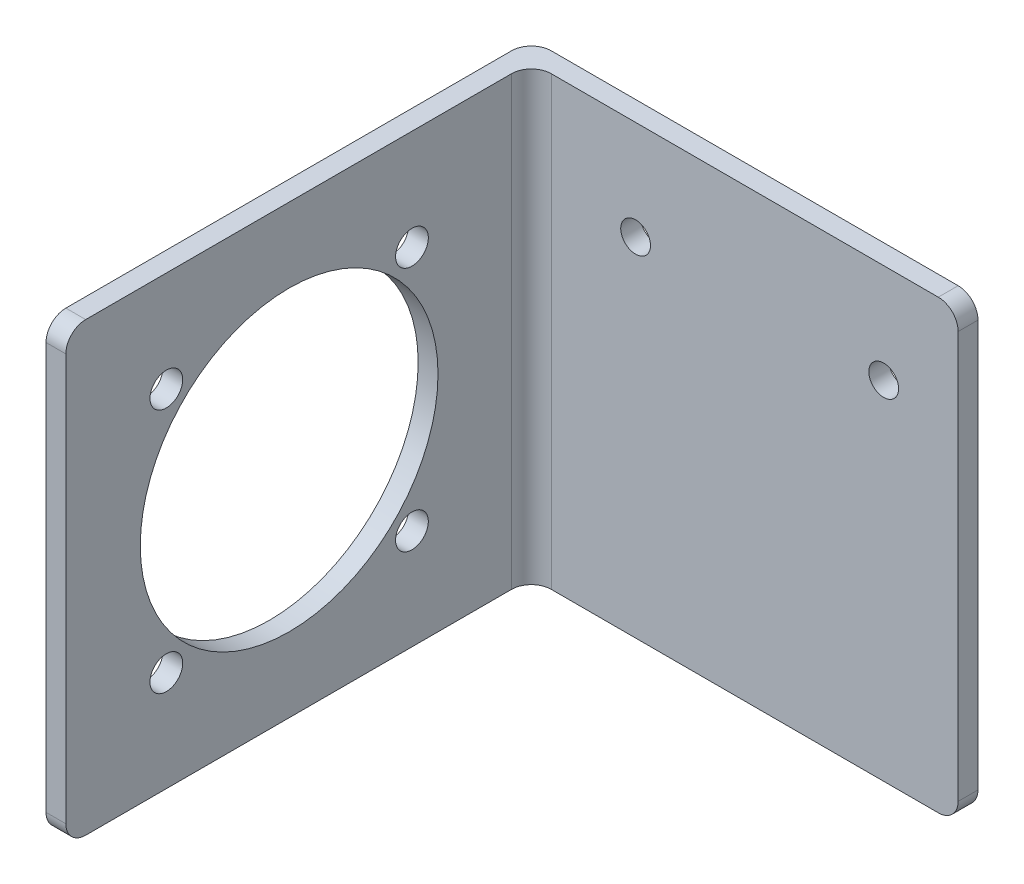
ISO-10303-21;
HEADER;
FILE_DESCRIPTION(('STEP AP214'),'2;1');
FILE_NAME('part.step','',(''),(''),'','','');
FILE_SCHEMA(('AUTOMOTIVE_DESIGN { 1 0 10303 214 1 1 1 1 }'));
ENDSEC;
DATA;
#1=APPLICATION_CONTEXT('core data for automotive mechanical design processes');
#2=APPLICATION_PROTOCOL_DEFINITION('international standard','automotive_design',2000,#1);
#3=PRODUCT_CONTEXT('',#1,'mechanical');
#4=PRODUCT('Part','Part','',(#3));
#5=PRODUCT_RELATED_PRODUCT_CATEGORY('part','',(#4));
#6=PRODUCT_DEFINITION_FORMATION('','',#4);
#7=PRODUCT_DEFINITION_CONTEXT('part definition',#1,'design');
#8=PRODUCT_DEFINITION('design','',#6,#7);
#9=PRODUCT_DEFINITION_SHAPE('','',#8);
#10=(LENGTH_UNIT() NAMED_UNIT(*) SI_UNIT(.MILLI.,.METRE.));
#11=(NAMED_UNIT(*) PLANE_ANGLE_UNIT() SI_UNIT($,.RADIAN.));
#12=(NAMED_UNIT(*) SI_UNIT($,.STERADIAN.) SOLID_ANGLE_UNIT());
#13=UNCERTAINTY_MEASURE_WITH_UNIT(LENGTH_MEASURE(1.E-05),#10,'distance_accuracy_value','');
#14=(GEOMETRIC_REPRESENTATION_CONTEXT(3) GLOBAL_UNCERTAINTY_ASSIGNED_CONTEXT((#13)) GLOBAL_UNIT_ASSIGNED_CONTEXT((#10,
#11,#12)) REPRESENTATION_CONTEXT('',''));
#15=CARTESIAN_POINT('',(0.,0.,0.));
#16=DIRECTION('',(0.,0.,1.));
#17=DIRECTION('',(1.,0.,0.));
#18=AXIS2_PLACEMENT_3D('',#15,#16,#17);
#19=CARTESIAN_POINT('',(0.,45.,-46.91));
#20=DIRECTION('',(0.,0.,-1.));
#21=DIRECTION('',(-1.,0.,0.));
#22=AXIS2_PLACEMENT_3D('',#19,#20,#21);
#23=PLANE('',#22);
#24=CARTESIAN_POINT('',(12.5,35.,-46.91));
#25=DIRECTION('',(0.,0.,1.));
#26=DIRECTION('',(1.,0.,0.));
#27=AXIS2_PLACEMENT_3D('',#24,#25,#26);
#28=CIRCLE('',#27,1.5);
#29=CARTESIAN_POINT('',(14.,35.,-46.91));
#30=VERTEX_POINT('',#29);
#31=EDGE_CURVE('E238',#30,#30,#28,.T.);
#32=ORIENTED_EDGE('',*,*,#31,.F.);
#33=EDGE_LOOP('',(#32));
#34=FACE_BOUND('',#33,.T.);
#35=CARTESIAN_POINT('',(37.5,35.,-46.91));
#36=DIRECTION('',(0.,0.,1.));
#37=DIRECTION('',(1.,0.,0.));
#38=AXIS2_PLACEMENT_3D('',#35,#36,#37);
#39=CIRCLE('',#38,1.5);
#40=CARTESIAN_POINT('',(39.,35.,-46.91));
#41=VERTEX_POINT('',#40);
#42=EDGE_CURVE('E244',#41,#41,#39,.T.);
#43=ORIENTED_EDGE('',*,*,#42,.F.);
#44=EDGE_LOOP('',(#43));
#45=FACE_BOUND('',#44,.T.);
#46=DIRECTION('',(1.,0.,0.));
#47=VECTOR('',#46,1.);
#48=CARTESIAN_POINT('',(0.,0.,-46.91));
#49=LINE('',#48,#47);
#50=CARTESIAN_POINT('',(4.,0.,-46.91));
#51=VERTEX_POINT('',#50);
#52=CARTESIAN_POINT('',(43.,0.,-46.91));
#53=VERTEX_POINT('',#52);
#54=EDGE_CURVE('E149',#51,#53,#49,.T.);
#55=ORIENTED_EDGE('',*,*,#54,.T.);
#56=CARTESIAN_POINT('',(43.,2.,-46.91));
#57=DIRECTION('',(0.,0.,-1.));
#58=DIRECTION('',(-1.,0.,0.));
#59=AXIS2_PLACEMENT_3D('',#56,#57,#58);
#60=CIRCLE('',#59,2.);
#61=CARTESIAN_POINT('',(45.,2.00000000000002,-46.91));
#62=VERTEX_POINT('',#61);
#63=EDGE_CURVE('E200',#53,#62,#60,.F.);
#64=ORIENTED_EDGE('',*,*,#63,.T.);
#65=DIRECTION('',(0.,-1.,0.));
#66=VECTOR('',#65,1.);
#67=CARTESIAN_POINT('',(45.,45.,-46.91));
#68=LINE('',#67,#66);
#69=CARTESIAN_POINT('',(45.,43.,-46.91));
#70=VERTEX_POINT('',#69);
#71=EDGE_CURVE('E152',#70,#62,#68,.T.);
#72=ORIENTED_EDGE('',*,*,#71,.F.);
#73=CARTESIAN_POINT('',(43.,43.,-46.91));
#74=DIRECTION('',(0.,0.,-1.));
#75=DIRECTION('',(-1.,0.,0.));
#76=AXIS2_PLACEMENT_3D('',#73,#74,#75);
#77=CIRCLE('',#76,2.);
#78=CARTESIAN_POINT('',(43.,45.,-46.91));
#79=VERTEX_POINT('',#78);
#80=EDGE_CURVE('E198',#70,#79,#77,.F.);
#81=ORIENTED_EDGE('',*,*,#80,.T.);
#82=DIRECTION('',(1.,0.,0.));
#83=VECTOR('',#82,1.);
#84=CARTESIAN_POINT('',(0.,45.,-46.91));
#85=LINE('',#84,#83);
#86=CARTESIAN_POINT('',(4.,45.,-46.91));
#87=VERTEX_POINT('',#86);
#88=EDGE_CURVE('E151',#87,#79,#85,.T.);
#89=ORIENTED_EDGE('',*,*,#88,.F.);
#90=DIRECTION('',(0.,-1.,0.));
#91=VECTOR('',#90,1.);
#92=CARTESIAN_POINT('',(4.,0.,-46.91));
#93=LINE('',#92,#91);
#94=EDGE_CURVE('E137',#87,#51,#93,.T.);
#95=ORIENTED_EDGE('',*,*,#94,.T.);
#96=EDGE_LOOP('',(#55,#64,#72,#81,#89,#95));
#97=FACE_BOUND('',#96,.T.);
#98=ADVANCED_FACE('F41',(#34,#45,#97),#23,.F.);
#99=CARTESIAN_POINT('',(45.,45.,-48.91));
#100=DIRECTION('',(1.,0.,0.));
#101=DIRECTION('',(0.,0.,-1.));
#102=AXIS2_PLACEMENT_3D('',#99,#100,#101);
#103=PLANE('',#102);
#104=ORIENTED_EDGE('',*,*,#71,.T.);
#105=DIRECTION('',(0.,0.,1.));
#106=VECTOR('',#105,1.);
#107=CARTESIAN_POINT('',(45.,2.,-48.91));
#108=LINE('',#107,#106);
#109=CARTESIAN_POINT('',(45.,2.00000000000002,-48.91));
#110=VERTEX_POINT('',#109);
#111=EDGE_CURVE('E205',#62,#110,#108,.F.);
#112=ORIENTED_EDGE('',*,*,#111,.T.);
#113=DIRECTION('',(0.,-1.,0.));
#114=VECTOR('',#113,1.);
#115=CARTESIAN_POINT('',(45.,45.,-48.91));
#116=LINE('',#115,#114);
#117=CARTESIAN_POINT('',(45.,43.,-48.91));
#118=VERTEX_POINT('',#117);
#119=EDGE_CURVE('E178',#118,#110,#116,.T.);
#120=ORIENTED_EDGE('',*,*,#119,.F.);
#121=DIRECTION('',(0.,0.,1.));
#122=VECTOR('',#121,1.);
#123=CARTESIAN_POINT('',(45.,43.,-46.91));
#124=LINE('',#123,#122);
#125=EDGE_CURVE('E202',#118,#70,#124,.T.);
#126=ORIENTED_EDGE('',*,*,#125,.T.);
#127=EDGE_LOOP('',(#104,#112,#120,#126));
#128=FACE_BOUND('',#127,.T.);
#129=ADVANCED_FACE('F300',(#128),#103,.T.);
#130=CARTESIAN_POINT('',(0.,45.,-48.91));
#131=DIRECTION('',(0.,0.,-1.));
#132=DIRECTION('',(-1.,0.,0.));
#133=AXIS2_PLACEMENT_3D('',#130,#131,#132);
#134=PLANE('',#133);
#135=CARTESIAN_POINT('',(12.5,35.,-48.91));
#136=DIRECTION('',(0.,0.,-1.));
#137=DIRECTION('',(-1.,0.,0.));
#138=AXIS2_PLACEMENT_3D('',#135,#136,#137);
#139=CIRCLE('',#138,1.5);
#140=CARTESIAN_POINT('',(11.,35.,-48.91));
#141=VERTEX_POINT('',#140);
#142=EDGE_CURVE('E45',#141,#141,#139,.T.);
#143=ORIENTED_EDGE('',*,*,#142,.F.);
#144=EDGE_LOOP('',(#143));
#145=FACE_BOUND('',#144,.T.);
#146=CARTESIAN_POINT('',(37.5,35.,-48.91));
#147=DIRECTION('',(0.,0.,-1.));
#148=DIRECTION('',(-1.,0.,0.));
#149=AXIS2_PLACEMENT_3D('',#146,#147,#148);
#150=CIRCLE('',#149,1.5);
#151=CARTESIAN_POINT('',(36.,35.,-48.91));
#152=VERTEX_POINT('',#151);
#153=EDGE_CURVE('E236',#152,#152,#150,.T.);
#154=ORIENTED_EDGE('',*,*,#153,.F.);
#155=EDGE_LOOP('',(#154));
#156=FACE_BOUND('',#155,.T.);
#157=ORIENTED_EDGE('',*,*,#119,.T.);
#158=CARTESIAN_POINT('',(43.,2.,-48.91));
#159=DIRECTION('',(0.,0.,-1.));
#160=DIRECTION('',(-1.,0.,0.));
#161=AXIS2_PLACEMENT_3D('',#158,#159,#160);
#162=CIRCLE('',#161,2.);
#163=CARTESIAN_POINT('',(43.,0.,-48.91));
#164=VERTEX_POINT('',#163);
#165=EDGE_CURVE('E209',#110,#164,#162,.T.);
#166=ORIENTED_EDGE('',*,*,#165,.T.);
#167=DIRECTION('',(1.,0.,0.));
#168=VECTOR('',#167,1.);
#169=CARTESIAN_POINT('',(0.,0.,-48.91));
#170=LINE('',#169,#168);
#171=CARTESIAN_POINT('',(2.,0.,-48.91));
#172=VERTEX_POINT('',#171);
#173=EDGE_CURVE('E159',#172,#164,#170,.T.);
#174=ORIENTED_EDGE('',*,*,#173,.F.);
#175=DIRECTION('',(0.,-1.,0.));
#176=VECTOR('',#175,1.);
#177=CARTESIAN_POINT('',(2.,45.,-48.91));
#178=LINE('',#177,#176);
#179=CARTESIAN_POINT('',(2.,45.,-48.91));
#180=VERTEX_POINT('',#179);
#181=EDGE_CURVE('E189',#172,#180,#178,.F.);
#182=ORIENTED_EDGE('',*,*,#181,.T.);
#183=DIRECTION('',(1.,0.,0.));
#184=VECTOR('',#183,1.);
#185=CARTESIAN_POINT('',(0.,45.,-48.91));
#186=LINE('',#185,#184);
#187=CARTESIAN_POINT('',(43.,45.,-48.91));
#188=VERTEX_POINT('',#187);
#189=EDGE_CURVE('E264',#180,#188,#186,.T.);
#190=ORIENTED_EDGE('',*,*,#189,.T.);
#191=CARTESIAN_POINT('',(43.,43.,-48.91));
#192=DIRECTION('',(0.,0.,-1.));
#193=DIRECTION('',(-1.,0.,0.));
#194=AXIS2_PLACEMENT_3D('',#191,#192,#193);
#195=CIRCLE('',#194,2.);
#196=EDGE_CURVE('E207',#188,#118,#195,.T.);
#197=ORIENTED_EDGE('',*,*,#196,.T.);
#198=EDGE_LOOP('',(#157,#166,#174,#182,#190,#197));
#199=FACE_BOUND('',#198,.T.);
#200=ADVANCED_FACE('F292',(#145,#156,#199),#134,.T.);
#201=CARTESIAN_POINT('',(0.,45.,0.));
#202=DIRECTION('',(-1.,0.,0.));
#203=DIRECTION('',(0.,0.,1.));
#204=AXIS2_PLACEMENT_3D('',#201,#202,#203);
#205=PLANE('',#204);
#206=CARTESIAN_POINT('',(0.,34.8743686707187,-34.8743686708039));
#207=DIRECTION('',(-1.,0.,0.));
#208=DIRECTION('',(0.,0.,1.));
#209=AXIS2_PLACEMENT_3D('',#206,#207,#208);
#210=CIRCLE('',#209,1.65000000004969);
#211=CARTESIAN_POINT('',(0.,34.8743686707187,-33.2243686707542));
#212=VERTEX_POINT('',#211);
#213=EDGE_CURVE('E242',#212,#212,#210,.T.);
#214=ORIENTED_EDGE('',*,*,#213,.F.);
#215=EDGE_LOOP('',(#214));
#216=FACE_BOUND('',#215,.T.);
#217=CARTESIAN_POINT('',(0.,34.8743686708061,-10.1256313292748));
#218=DIRECTION('',(-1.,0.,0.));
#219=DIRECTION('',(0.,0.,1.));
#220=AXIS2_PLACEMENT_3D('',#217,#218,#219);
#221=CIRCLE('',#220,1.65000000002409);
#222=CARTESIAN_POINT('',(0.,34.8743686708061,-8.47563132925066));
#223=VERTEX_POINT('',#222);
#224=EDGE_CURVE('E254',#223,#223,#221,.T.);
#225=ORIENTED_EDGE('',*,*,#224,.F.);
#226=EDGE_LOOP('',(#225));
#227=FACE_BOUND('',#226,.T.);
#228=CARTESIAN_POINT('',(0.,10.1256313292769,-10.1256313291873));
#229=DIRECTION('',(-1.,0.,0.));
#230=DIRECTION('',(0.,0.,1.));
#231=AXIS2_PLACEMENT_3D('',#228,#229,#230);
#232=CIRCLE('',#231,1.64999999994039);
#233=CARTESIAN_POINT('',(0.,10.1256313292769,-8.47563132924689));
#234=VERTEX_POINT('',#233);
#235=EDGE_CURVE('E251',#234,#234,#232,.T.);
#236=ORIENTED_EDGE('',*,*,#235,.F.);
#237=EDGE_LOOP('',(#236));
#238=FACE_BOUND('',#237,.T.);
#239=CARTESIAN_POINT('',(0.,10.1256313291895,-34.8743686707165));
#240=DIRECTION('',(-1.,0.,0.));
#241=DIRECTION('',(0.,0.,1.));
#242=AXIS2_PLACEMENT_3D('',#239,#240,#241);
#243=CIRCLE('',#242,1.64999999996599);
#244=CARTESIAN_POINT('',(0.,10.1256313291895,-33.2243686707505));
#245=VERTEX_POINT('',#244);
#246=EDGE_CURVE('E228',#245,#245,#243,.T.);
#247=ORIENTED_EDGE('',*,*,#246,.F.);
#248=EDGE_LOOP('',(#247));
#249=FACE_BOUND('',#248,.T.);
#250=CARTESIAN_POINT('',(0.,22.5,-22.5));
#251=DIRECTION('',(-1.,0.,0.));
#252=DIRECTION('',(0.,0.,1.));
#253=AXIS2_PLACEMENT_3D('',#250,#251,#252);
#254=CIRCLE('',#253,15.);
#255=CARTESIAN_POINT('',(0.,22.5,-7.5));
#256=VERTEX_POINT('',#255);
#257=EDGE_CURVE('E165',#256,#256,#254,.T.);
#258=ORIENTED_EDGE('',*,*,#257,.F.);
#259=EDGE_LOOP('',(#258));
#260=FACE_BOUND('',#259,.T.);
#261=DIRECTION('',(0.,0.,-1.));
#262=VECTOR('',#261,1.);
#263=CARTESIAN_POINT('',(0.,0.,0.));
#264=LINE('',#263,#262);
#265=CARTESIAN_POINT('',(0.,0.,-2.));
#266=VERTEX_POINT('',#265);
#267=CARTESIAN_POINT('',(0.,0.,-46.91));
#268=VERTEX_POINT('',#267);
#269=EDGE_CURVE('E162',#266,#268,#264,.T.);
#270=ORIENTED_EDGE('',*,*,#269,.F.);
#271=CARTESIAN_POINT('',(0.,2.,-2.));
#272=DIRECTION('',(-1.,0.,0.));
#273=DIRECTION('',(0.,0.,1.));
#274=AXIS2_PLACEMENT_3D('',#271,#272,#273);
#275=CIRCLE('',#274,2.);
#276=CARTESIAN_POINT('',(0.,2.00000000000002,0.));
#277=VERTEX_POINT('',#276);
#278=EDGE_CURVE('E217',#266,#277,#275,.T.);
#279=ORIENTED_EDGE('',*,*,#278,.T.);
#280=DIRECTION('',(0.,-1.,0.));
#281=VECTOR('',#280,1.);
#282=CARTESIAN_POINT('',(0.,45.,0.));
#283=LINE('',#282,#281);
#284=CARTESIAN_POINT('',(0.,43.,0.));
#285=VERTEX_POINT('',#284);
#286=EDGE_CURVE('E176',#285,#277,#283,.T.);
#287=ORIENTED_EDGE('',*,*,#286,.F.);
#288=CARTESIAN_POINT('',(0.,43.,-2.));
#289=DIRECTION('',(-1.,0.,0.));
#290=DIRECTION('',(0.,0.,1.));
#291=AXIS2_PLACEMENT_3D('',#288,#289,#290);
#292=CIRCLE('',#291,2.);
#293=CARTESIAN_POINT('',(0.,45.,-2.));
#294=VERTEX_POINT('',#293);
#295=EDGE_CURVE('E215',#285,#294,#292,.T.);
#296=ORIENTED_EDGE('',*,*,#295,.T.);
#297=DIRECTION('',(0.,0.,-1.));
#298=VECTOR('',#297,1.);
#299=CARTESIAN_POINT('',(0.,45.,0.));
#300=LINE('',#299,#298);
#301=CARTESIAN_POINT('',(0.,45.,-46.91));
#302=VERTEX_POINT('',#301);
#303=EDGE_CURVE('E266',#294,#302,#300,.T.);
#304=ORIENTED_EDGE('',*,*,#303,.T.);
#305=DIRECTION('',(0.,-1.,0.));
#306=VECTOR('',#305,1.);
#307=CARTESIAN_POINT('',(0.,45.,-46.91));
#308=LINE('',#307,#306);
#309=EDGE_CURVE('E184',#302,#268,#308,.T.);
#310=ORIENTED_EDGE('',*,*,#309,.T.);
#311=EDGE_LOOP('',(#270,#279,#287,#296,#304,#310));
#312=FACE_BOUND('',#311,.T.);
#313=ADVANCED_FACE('F279',(#216,#227,#238,#249,#260,#312),#205,.T.);
#314=CARTESIAN_POINT('',(2.,45.,0.));
#315=DIRECTION('',(0.,0.,1.));
#316=DIRECTION('',(1.,0.,0.));
#317=AXIS2_PLACEMENT_3D('',#314,#315,#316);
#318=PLANE('',#317);
#319=ORIENTED_EDGE('',*,*,#286,.T.);
#320=DIRECTION('',(-1.,0.,0.));
#321=VECTOR('',#320,1.);
#322=CARTESIAN_POINT('',(2.,2.,0.));
#323=LINE('',#322,#321);
#324=CARTESIAN_POINT('',(2.,2.00000000000002,0.));
#325=VERTEX_POINT('',#324);
#326=EDGE_CURVE('E58',#277,#325,#323,.F.);
#327=ORIENTED_EDGE('',*,*,#326,.T.);
#328=DIRECTION('',(0.,-1.,0.));
#329=VECTOR('',#328,1.);
#330=CARTESIAN_POINT('',(2.,45.,0.));
#331=LINE('',#330,#329);
#332=CARTESIAN_POINT('',(2.,43.,0.));
#333=VERTEX_POINT('',#332);
#334=EDGE_CURVE('E174',#333,#325,#331,.T.);
#335=ORIENTED_EDGE('',*,*,#334,.F.);
#336=DIRECTION('',(-1.,0.,0.));
#337=VECTOR('',#336,1.);
#338=CARTESIAN_POINT('',(0.,43.,0.));
#339=LINE('',#338,#337);
#340=EDGE_CURVE('E219',#333,#285,#339,.T.);
#341=ORIENTED_EDGE('',*,*,#340,.T.);
#342=EDGE_LOOP('',(#319,#327,#335,#341));
#343=FACE_BOUND('',#342,.T.);
#344=ADVANCED_FACE('F280',(#343),#318,.T.);
#345=CARTESIAN_POINT('',(2.,45.,0.));
#346=DIRECTION('',(-1.,0.,0.));
#347=DIRECTION('',(0.,0.,1.));
#348=AXIS2_PLACEMENT_3D('',#345,#346,#347);
#349=PLANE('',#348);
#350=CARTESIAN_POINT('',(2.,34.8743686707187,-34.8743686708039));
#351=DIRECTION('',(-1.,0.,0.));
#352=DIRECTION('',(0.,0.,1.));
#353=AXIS2_PLACEMENT_3D('',#350,#351,#352);
#354=CIRCLE('',#353,1.65000000004969);
#355=CARTESIAN_POINT('',(2.,34.8743686707187,-33.2243686707542));
#356=VERTEX_POINT('',#355);
#357=EDGE_CURVE('E234',#356,#356,#354,.T.);
#358=ORIENTED_EDGE('',*,*,#357,.T.);
#359=EDGE_LOOP('',(#358));
#360=FACE_BOUND('',#359,.T.);
#361=CARTESIAN_POINT('',(2.,34.8743686708061,-10.1256313292748));
#362=DIRECTION('',(-1.,0.,0.));
#363=DIRECTION('',(0.,0.,1.));
#364=AXIS2_PLACEMENT_3D('',#361,#362,#363);
#365=CIRCLE('',#364,1.65000000002409);
#366=CARTESIAN_POINT('',(2.,34.8743686708061,-8.47563132925066));
#367=VERTEX_POINT('',#366);
#368=EDGE_CURVE('E231',#367,#367,#365,.T.);
#369=ORIENTED_EDGE('',*,*,#368,.T.);
#370=EDGE_LOOP('',(#369));
#371=FACE_BOUND('',#370,.T.);
#372=CARTESIAN_POINT('',(2.,10.1256313292769,-10.1256313291873));
#373=DIRECTION('',(-1.,0.,0.));
#374=DIRECTION('',(0.,0.,1.));
#375=AXIS2_PLACEMENT_3D('',#372,#373,#374);
#376=CIRCLE('',#375,1.64999999994039);
#377=CARTESIAN_POINT('',(2.,10.1256313292769,-8.47563132924689));
#378=VERTEX_POINT('',#377);
#379=EDGE_CURVE('E227',#378,#378,#376,.T.);
#380=ORIENTED_EDGE('',*,*,#379,.T.);
#381=EDGE_LOOP('',(#380));
#382=FACE_BOUND('',#381,.T.);
#383=CARTESIAN_POINT('',(2.,10.1256313291895,-34.8743686707165));
#384=DIRECTION('',(-1.,0.,0.));
#385=DIRECTION('',(0.,0.,1.));
#386=AXIS2_PLACEMENT_3D('',#383,#384,#385);
#387=CIRCLE('',#386,1.64999999996599);
#388=CARTESIAN_POINT('',(2.,10.1256313291895,-33.2243686707505));
#389=VERTEX_POINT('',#388);
#390=EDGE_CURVE('E224',#389,#389,#387,.T.);
#391=ORIENTED_EDGE('',*,*,#390,.T.);
#392=EDGE_LOOP('',(#391));
#393=FACE_BOUND('',#392,.T.);
#394=CARTESIAN_POINT('',(2.,22.5,-22.5));
#395=DIRECTION('',(-1.,0.,0.));
#396=DIRECTION('',(0.,0.,1.));
#397=AXIS2_PLACEMENT_3D('',#394,#395,#396);
#398=CIRCLE('',#397,15.);
#399=CARTESIAN_POINT('',(2.,22.5,-7.5));
#400=VERTEX_POINT('',#399);
#401=EDGE_CURVE('E160',#400,#400,#398,.T.);
#402=ORIENTED_EDGE('',*,*,#401,.T.);
#403=EDGE_LOOP('',(#402));
#404=FACE_BOUND('',#403,.T.);
#405=ORIENTED_EDGE('',*,*,#334,.T.);
#406=CARTESIAN_POINT('',(2.,2.,-2.));
#407=DIRECTION('',(-1.,0.,0.));
#408=DIRECTION('',(0.,0.,1.));
#409=AXIS2_PLACEMENT_3D('',#406,#407,#408);
#410=CIRCLE('',#409,2.);
#411=CARTESIAN_POINT('',(2.,0.,-2.));
#412=VERTEX_POINT('',#411);
#413=EDGE_CURVE('E11',#325,#412,#410,.F.);
#414=ORIENTED_EDGE('',*,*,#413,.T.);
#415=DIRECTION('',(0.,0.,-1.));
#416=VECTOR('',#415,1.);
#417=CARTESIAN_POINT('',(2.,0.,0.));
#418=LINE('',#417,#416);
#419=CARTESIAN_POINT('',(2.,0.,-44.91));
#420=VERTEX_POINT('',#419);
#421=EDGE_CURVE('E172',#412,#420,#418,.T.);
#422=ORIENTED_EDGE('',*,*,#421,.T.);
#423=DIRECTION('',(0.,-1.,0.));
#424=VECTOR('',#423,1.);
#425=CARTESIAN_POINT('',(2.,45.,-44.91));
#426=LINE('',#425,#424);
#427=CARTESIAN_POINT('',(2.,45.,-44.91));
#428=VERTEX_POINT('',#427);
#429=EDGE_CURVE('E139',#420,#428,#426,.F.);
#430=ORIENTED_EDGE('',*,*,#429,.T.);
#431=DIRECTION('',(0.,0.,-1.));
#432=VECTOR('',#431,1.);
#433=CARTESIAN_POINT('',(2.,45.,0.));
#434=LINE('',#433,#432);
#435=CARTESIAN_POINT('',(2.,45.,-2.));
#436=VERTEX_POINT('',#435);
#437=EDGE_CURVE('E168',#436,#428,#434,.T.);
#438=ORIENTED_EDGE('',*,*,#437,.F.);
#439=CARTESIAN_POINT('',(2.,43.,-2.));
#440=DIRECTION('',(-1.,0.,0.));
#441=DIRECTION('',(0.,0.,1.));
#442=AXIS2_PLACEMENT_3D('',#439,#440,#441);
#443=CIRCLE('',#442,2.);
#444=EDGE_CURVE('E50',#436,#333,#443,.F.);
#445=ORIENTED_EDGE('',*,*,#444,.T.);
#446=EDGE_LOOP('',(#405,#414,#422,#430,#438,#445));
#447=FACE_BOUND('',#446,.T.);
#448=ADVANCED_FACE('F272',(#360,#371,#382,#393,#404,#447),#349,.F.);
#449=CARTESIAN_POINT('',(0.,45.,0.));
#450=DIRECTION('',(0.,-1.,0.));
#451=DIRECTION('',(-1.,0.,0.));
#452=AXIS2_PLACEMENT_3D('',#449,#450,#451);
#453=PLANE('',#452);
#454=ORIENTED_EDGE('',*,*,#88,.T.);
#455=DIRECTION('',(0.,0.,1.));
#456=VECTOR('',#455,1.);
#457=CARTESIAN_POINT('',(43.,45.,-48.91));
#458=LINE('',#457,#456);
#459=EDGE_CURVE('E213',#79,#188,#458,.F.);
#460=ORIENTED_EDGE('',*,*,#459,.T.);
#461=ORIENTED_EDGE('',*,*,#189,.F.);
#462=CARTESIAN_POINT('',(2.,45.,-46.91));
#463=DIRECTION('',(0.,-1.,0.));
#464=DIRECTION('',(0.,0.,-1.));
#465=AXIS2_PLACEMENT_3D('',#462,#463,#464);
#466=CIRCLE('',#465,2.);
#467=EDGE_CURVE('E144',#180,#302,#466,.F.);
#468=ORIENTED_EDGE('',*,*,#467,.T.);
#469=ORIENTED_EDGE('',*,*,#303,.F.);
#470=DIRECTION('',(-1.,0.,0.));
#471=VECTOR('',#470,1.);
#472=CARTESIAN_POINT('',(2.,45.,-2.));
#473=LINE('',#472,#471);
#474=EDGE_CURVE('E211',#294,#436,#473,.F.);
#475=ORIENTED_EDGE('',*,*,#474,.T.);
#476=ORIENTED_EDGE('',*,*,#437,.T.);
#477=CARTESIAN_POINT('',(4.,45.,-44.91));
#478=DIRECTION('',(0.,-1.,0.));
#479=DIRECTION('',(0.,0.,-1.));
#480=AXIS2_PLACEMENT_3D('',#477,#478,#479);
#481=CIRCLE('',#480,2.);
#482=EDGE_CURVE('E143',#428,#87,#481,.T.);
#483=ORIENTED_EDGE('',*,*,#482,.T.);
#484=EDGE_LOOP('',(#454,#460,#461,#468,#469,#475,#476,#483));
#485=FACE_BOUND('',#484,.T.);
#486=ADVANCED_FACE('F270',(#485),#453,.F.);
#487=CARTESIAN_POINT('',(0.,0.,0.));
#488=DIRECTION('',(0.,-1.,0.));
#489=DIRECTION('',(-1.,0.,0.));
#490=AXIS2_PLACEMENT_3D('',#487,#488,#489);
#491=PLANE('',#490);
#492=ORIENTED_EDGE('',*,*,#173,.T.);
#493=DIRECTION('',(0.,0.,1.));
#494=VECTOR('',#493,1.);
#495=CARTESIAN_POINT('',(43.,0.,0.));
#496=LINE('',#495,#494);
#497=EDGE_CURVE('E158',#164,#53,#496,.T.);
#498=ORIENTED_EDGE('',*,*,#497,.T.);
#499=ORIENTED_EDGE('',*,*,#54,.F.);
#500=CARTESIAN_POINT('',(4.,0.,-44.91));
#501=DIRECTION('',(0.,-1.,0.));
#502=DIRECTION('',(0.,0.,-1.));
#503=AXIS2_PLACEMENT_3D('',#500,#501,#502);
#504=CIRCLE('',#503,2.);
#505=EDGE_CURVE('E133',#51,#420,#504,.F.);
#506=ORIENTED_EDGE('',*,*,#505,.T.);
#507=ORIENTED_EDGE('',*,*,#421,.F.);
#508=DIRECTION('',(-1.,0.,0.));
#509=VECTOR('',#508,1.);
#510=CARTESIAN_POINT('',(0.,0.,-2.));
#511=LINE('',#510,#509);
#512=EDGE_CURVE('E193',#412,#266,#511,.T.);
#513=ORIENTED_EDGE('',*,*,#512,.T.);
#514=ORIENTED_EDGE('',*,*,#269,.T.);
#515=CARTESIAN_POINT('',(2.,0.,-46.91));
#516=DIRECTION('',(0.,-1.,0.));
#517=DIRECTION('',(0.,0.,-1.));
#518=AXIS2_PLACEMENT_3D('',#515,#516,#517);
#519=CIRCLE('',#518,2.);
#520=EDGE_CURVE('E187',#268,#172,#519,.T.);
#521=ORIENTED_EDGE('',*,*,#520,.T.);
#522=EDGE_LOOP('',(#492,#498,#499,#506,#507,#513,#514,#521));
#523=FACE_BOUND('',#522,.T.);
#524=ADVANCED_FACE('F156',(#523),#491,.T.);
#525=CARTESIAN_POINT('',(4.,45.,-44.91));
#526=DIRECTION('',(0.,1.,0.));
#527=DIRECTION('',(0.,0.,1.));
#528=AXIS2_PLACEMENT_3D('',#525,#526,#527);
#529=CYLINDRICAL_SURFACE('',#528,2.);
#530=ORIENTED_EDGE('',*,*,#482,.F.);
#531=ORIENTED_EDGE('',*,*,#429,.F.);
#532=ORIENTED_EDGE('',*,*,#505,.F.);
#533=ORIENTED_EDGE('',*,*,#94,.F.);
#534=EDGE_LOOP('',(#530,#531,#532,#533));
#535=FACE_BOUND('',#534,.T.);
#536=ADVANCED_FACE('F136',(#535),#529,.F.);
#537=CARTESIAN_POINT('',(2.,45.,-46.91));
#538=DIRECTION('',(0.,-1.,0.));
#539=DIRECTION('',(0.,0.,-1.));
#540=AXIS2_PLACEMENT_3D('',#537,#538,#539);
#541=CYLINDRICAL_SURFACE('',#540,2.);
#542=ORIENTED_EDGE('',*,*,#467,.F.);
#543=ORIENTED_EDGE('',*,*,#181,.F.);
#544=ORIENTED_EDGE('',*,*,#520,.F.);
#545=ORIENTED_EDGE('',*,*,#309,.F.);
#546=EDGE_LOOP('',(#542,#543,#544,#545));
#547=FACE_BOUND('',#546,.T.);
#548=ADVANCED_FACE('F289',(#547),#541,.T.);
#549=CARTESIAN_POINT('',(10.,22.5,-22.5));
#550=DIRECTION('',(-1.,0.,0.));
#551=DIRECTION('',(0.,0.,1.));
#552=AXIS2_PLACEMENT_3D('',#549,#550,#551);
#553=CYLINDRICAL_SURFACE('',#552,15.);
#554=ORIENTED_EDGE('',*,*,#257,.T.);
#555=EDGE_LOOP('',(#554));
#556=FACE_BOUND('',#555,.T.);
#557=ORIENTED_EDGE('',*,*,#401,.F.);
#558=EDGE_LOOP('',(#557));
#559=FACE_BOUND('',#558,.T.);
#560=ADVANCED_FACE('F312',(#556,#559),#553,.F.);
#561=CARTESIAN_POINT('',(43.,2.,0.));
#562=DIRECTION('',(0.,0.,1.));
#563=DIRECTION('',(1.,0.,0.));
#564=AXIS2_PLACEMENT_3D('',#561,#562,#563);
#565=CYLINDRICAL_SURFACE('',#564,2.);
#566=ORIENTED_EDGE('',*,*,#165,.F.);
#567=ORIENTED_EDGE('',*,*,#111,.F.);
#568=ORIENTED_EDGE('',*,*,#63,.F.);
#569=ORIENTED_EDGE('',*,*,#497,.F.);
#570=EDGE_LOOP('',(#566,#567,#568,#569));
#571=FACE_BOUND('',#570,.T.);
#572=ADVANCED_FACE('F297',(#571),#565,.T.);
#573=CARTESIAN_POINT('',(43.,43.,-48.91));
#574=DIRECTION('',(0.,0.,-1.));
#575=DIRECTION('',(-1.,0.,0.));
#576=AXIS2_PLACEMENT_3D('',#573,#574,#575);
#577=CYLINDRICAL_SURFACE('',#576,2.);
#578=ORIENTED_EDGE('',*,*,#196,.F.);
#579=ORIENTED_EDGE('',*,*,#459,.F.);
#580=ORIENTED_EDGE('',*,*,#80,.F.);
#581=ORIENTED_EDGE('',*,*,#125,.F.);
#582=EDGE_LOOP('',(#578,#579,#580,#581));
#583=FACE_BOUND('',#582,.T.);
#584=ADVANCED_FACE('F304',(#583),#577,.T.);
#585=CARTESIAN_POINT('',(0.,2.,-2.));
#586=DIRECTION('',(-1.,0.,0.));
#587=DIRECTION('',(0.,0.,1.));
#588=AXIS2_PLACEMENT_3D('',#585,#586,#587);
#589=CYLINDRICAL_SURFACE('',#588,2.);
#590=ORIENTED_EDGE('',*,*,#413,.F.);
#591=ORIENTED_EDGE('',*,*,#326,.F.);
#592=ORIENTED_EDGE('',*,*,#278,.F.);
#593=ORIENTED_EDGE('',*,*,#512,.F.);
#594=EDGE_LOOP('',(#590,#591,#592,#593));
#595=FACE_BOUND('',#594,.T.);
#596=ADVANCED_FACE('F277',(#595),#589,.T.);
#597=CARTESIAN_POINT('',(2.,43.,-2.));
#598=DIRECTION('',(1.,0.,0.));
#599=DIRECTION('',(0.,0.,-1.));
#600=AXIS2_PLACEMENT_3D('',#597,#598,#599);
#601=CYLINDRICAL_SURFACE('',#600,2.);
#602=ORIENTED_EDGE('',*,*,#444,.F.);
#603=ORIENTED_EDGE('',*,*,#474,.F.);
#604=ORIENTED_EDGE('',*,*,#295,.F.);
#605=ORIENTED_EDGE('',*,*,#340,.F.);
#606=EDGE_LOOP('',(#602,#603,#604,#605));
#607=FACE_BOUND('',#606,.T.);
#608=ADVANCED_FACE('F43',(#607),#601,.T.);
#609=CARTESIAN_POINT('',(10.,10.1256313291895,-34.8743686707165));
#610=DIRECTION('',(-1.,0.,0.));
#611=DIRECTION('',(0.,0.,1.));
#612=AXIS2_PLACEMENT_3D('',#609,#610,#611);
#613=CYLINDRICAL_SURFACE('',#612,1.64999999996599);
#614=ORIENTED_EDGE('',*,*,#246,.T.);
#615=EDGE_LOOP('',(#614));
#616=FACE_BOUND('',#615,.T.);
#617=ORIENTED_EDGE('',*,*,#390,.F.);
#618=EDGE_LOOP('',(#617));
#619=FACE_BOUND('',#618,.T.);
#620=ADVANCED_FACE('F339',(#616,#619),#613,.F.);
#621=CARTESIAN_POINT('',(10.,10.1256313292769,-10.1256313291873));
#622=DIRECTION('',(-1.,0.,0.));
#623=DIRECTION('',(0.,0.,1.));
#624=AXIS2_PLACEMENT_3D('',#621,#622,#623);
#625=CYLINDRICAL_SURFACE('',#624,1.64999999994039);
#626=ORIENTED_EDGE('',*,*,#235,.T.);
#627=EDGE_LOOP('',(#626));
#628=FACE_BOUND('',#627,.T.);
#629=ORIENTED_EDGE('',*,*,#379,.F.);
#630=EDGE_LOOP('',(#629));
#631=FACE_BOUND('',#630,.T.);
#632=ADVANCED_FACE('F368',(#628,#631),#625,.F.);
#633=CARTESIAN_POINT('',(10.,34.8743686708061,-10.1256313292748));
#634=DIRECTION('',(-1.,0.,0.));
#635=DIRECTION('',(0.,0.,1.));
#636=AXIS2_PLACEMENT_3D('',#633,#634,#635);
#637=CYLINDRICAL_SURFACE('',#636,1.65000000002409);
#638=ORIENTED_EDGE('',*,*,#224,.T.);
#639=EDGE_LOOP('',(#638));
#640=FACE_BOUND('',#639,.T.);
#641=ORIENTED_EDGE('',*,*,#368,.F.);
#642=EDGE_LOOP('',(#641));
#643=FACE_BOUND('',#642,.T.);
#644=ADVANCED_FACE('F371',(#640,#643),#637,.F.);
#645=CARTESIAN_POINT('',(10.,34.8743686707187,-34.8743686708039));
#646=DIRECTION('',(-1.,0.,0.));
#647=DIRECTION('',(0.,0.,1.));
#648=AXIS2_PLACEMENT_3D('',#645,#646,#647);
#649=CYLINDRICAL_SURFACE('',#648,1.65000000004969);
#650=ORIENTED_EDGE('',*,*,#213,.T.);
#651=EDGE_LOOP('',(#650));
#652=FACE_BOUND('',#651,.T.);
#653=ORIENTED_EDGE('',*,*,#357,.F.);
#654=EDGE_LOOP('',(#653));
#655=FACE_BOUND('',#654,.T.);
#656=ADVANCED_FACE('F365',(#652,#655),#649,.F.);
#657=CARTESIAN_POINT('',(37.5,35.,-56.91));
#658=DIRECTION('',(0.,0.,1.));
#659=DIRECTION('',(1.,0.,0.));
#660=AXIS2_PLACEMENT_3D('',#657,#658,#659);
#661=CYLINDRICAL_SURFACE('',#660,1.5);
#662=ORIENTED_EDGE('',*,*,#153,.T.);
#663=EDGE_LOOP('',(#662));
#664=FACE_BOUND('',#663,.T.);
#665=ORIENTED_EDGE('',*,*,#42,.T.);
#666=EDGE_LOOP('',(#665));
#667=FACE_BOUND('',#666,.T.);
#668=ADVANCED_FACE('F361',(#664,#667),#661,.F.);
#669=CARTESIAN_POINT('',(12.5,35.,-56.91));
#670=DIRECTION('',(0.,0.,1.));
#671=DIRECTION('',(1.,0.,0.));
#672=AXIS2_PLACEMENT_3D('',#669,#670,#671);
#673=CYLINDRICAL_SURFACE('',#672,1.5);
#674=ORIENTED_EDGE('',*,*,#142,.T.);
#675=EDGE_LOOP('',(#674));
#676=FACE_BOUND('',#675,.T.);
#677=ORIENTED_EDGE('',*,*,#31,.T.);
#678=EDGE_LOOP('',(#677));
#679=FACE_BOUND('',#678,.T.);
#680=ADVANCED_FACE('F359',(#676,#679),#673,.F.);
#681=CLOSED_SHELL('',(#98,#129,#200,#313,#344,#448,#486,#524,#536,#548,#560,#572,#584,#596,#608,
#620,#632,#644,#656,#668,#680));
#682=MANIFOLD_SOLID_BREP('B2',#681);
#683=ADVANCED_BREP_SHAPE_REPRESENTATION('',(#18,#682),#14);
#684=SHAPE_DEFINITION_REPRESENTATION(#9,#683);
ENDSEC;
END-ISO-10303-21;
